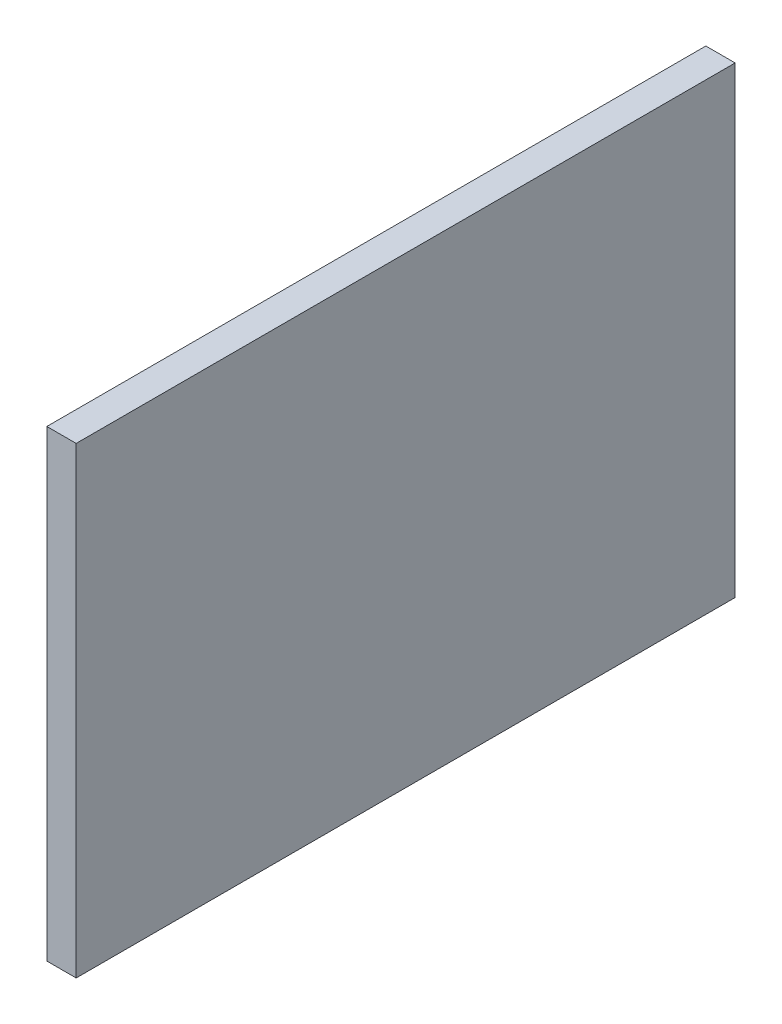
ISO-10303-21;
HEADER;
FILE_DESCRIPTION(('STEP AP214'),'2;1');
FILE_NAME('part.step','',(''),(''),'','','');
FILE_SCHEMA(('AUTOMOTIVE_DESIGN { 1 0 10303 214 1 1 1 1 }'));
ENDSEC;
DATA;
#1=APPLICATION_CONTEXT('core data for automotive mechanical design processes');
#2=APPLICATION_PROTOCOL_DEFINITION('international standard','automotive_design',2000,#1);
#3=PRODUCT_CONTEXT('',#1,'mechanical');
#4=PRODUCT('Part','Part','',(#3));
#5=PRODUCT_RELATED_PRODUCT_CATEGORY('part','',(#4));
#6=PRODUCT_DEFINITION_FORMATION('','',#4);
#7=PRODUCT_DEFINITION_CONTEXT('part definition',#1,'design');
#8=PRODUCT_DEFINITION('design','',#6,#7);
#9=PRODUCT_DEFINITION_SHAPE('','',#8);
#10=(LENGTH_UNIT() NAMED_UNIT(*) SI_UNIT(.MILLI.,.METRE.));
#11=(NAMED_UNIT(*) PLANE_ANGLE_UNIT() SI_UNIT($,.RADIAN.));
#12=(NAMED_UNIT(*) SI_UNIT($,.STERADIAN.) SOLID_ANGLE_UNIT());
#13=UNCERTAINTY_MEASURE_WITH_UNIT(LENGTH_MEASURE(1.E-05),#10,'distance_accuracy_value','');
#14=(GEOMETRIC_REPRESENTATION_CONTEXT(3) GLOBAL_UNCERTAINTY_ASSIGNED_CONTEXT((#13)) GLOBAL_UNIT_ASSIGNED_CONTEXT((#10,
#11,#12)) REPRESENTATION_CONTEXT('',''));
#15=CARTESIAN_POINT('',(0.,0.,0.));
#16=DIRECTION('',(0.,0.,1.));
#17=DIRECTION('',(1.,0.,0.));
#18=AXIS2_PLACEMENT_3D('',#15,#16,#17);
#19=CARTESIAN_POINT('',(19.,0.,0.));
#20=DIRECTION('',(0.,0.,-1.));
#21=DIRECTION('',(-1.,0.,0.));
#22=AXIS2_PLACEMENT_3D('',#19,#20,#21);
#23=PLANE('',#22);
#24=DIRECTION('',(0.,-1.,0.));
#25=VECTOR('',#24,1.);
#26=CARTESIAN_POINT('',(0.,0.,0.));
#27=LINE('',#26,#25);
#28=CARTESIAN_POINT('',(0.,300.,0.));
#29=VERTEX_POINT('',#28);
#30=CARTESIAN_POINT('',(0.,0.,0.));
#31=VERTEX_POINT('',#30);
#32=EDGE_CURVE('E96',#29,#31,#27,.T.);
#33=ORIENTED_EDGE('',*,*,#32,.T.);
#34=DIRECTION('',(-1.,0.,0.));
#35=VECTOR('',#34,1.);
#36=CARTESIAN_POINT('',(19.,0.,0.));
#37=LINE('',#36,#35);
#38=CARTESIAN_POINT('',(19.,0.,0.));
#39=VERTEX_POINT('',#38);
#40=EDGE_CURVE('E11',#39,#31,#37,.T.);
#41=ORIENTED_EDGE('',*,*,#40,.F.);
#42=DIRECTION('',(0.,-1.,0.));
#43=VECTOR('',#42,1.);
#44=CARTESIAN_POINT('',(19.,0.,0.));
#45=LINE('',#44,#43);
#46=CARTESIAN_POINT('',(19.,300.,0.));
#47=VERTEX_POINT('',#46);
#48=EDGE_CURVE('E84',#47,#39,#45,.T.);
#49=ORIENTED_EDGE('',*,*,#48,.F.);
#50=DIRECTION('',(-1.,0.,0.));
#51=VECTOR('',#50,1.);
#52=CARTESIAN_POINT('',(19.,300.,0.));
#53=LINE('',#52,#51);
#54=EDGE_CURVE('E92',#47,#29,#53,.T.);
#55=ORIENTED_EDGE('',*,*,#54,.T.);
#56=EDGE_LOOP('',(#33,#41,#49,#55));
#57=FACE_BOUND('',#56,.T.);
#58=ADVANCED_FACE('F33',(#57),#23,.F.);
#59=CARTESIAN_POINT('',(19.,0.,0.));
#60=DIRECTION('',(0.,1.,0.));
#61=DIRECTION('',(0.,0.,1.));
#62=AXIS2_PLACEMENT_3D('',#59,#60,#61);
#63=PLANE('',#62);
#64=DIRECTION('',(0.,0.,-1.));
#65=VECTOR('',#64,1.);
#66=CARTESIAN_POINT('',(0.,0.,0.));
#67=LINE('',#66,#65);
#68=CARTESIAN_POINT('',(0.,0.,-427.));
#69=VERTEX_POINT('',#68);
#70=EDGE_CURVE('E88',#31,#69,#67,.T.);
#71=ORIENTED_EDGE('',*,*,#70,.T.);
#72=DIRECTION('',(-1.,0.,0.));
#73=VECTOR('',#72,1.);
#74=CARTESIAN_POINT('',(19.,0.,-427.));
#75=LINE('',#74,#73);
#76=CARTESIAN_POINT('',(19.,0.,-427.));
#77=VERTEX_POINT('',#76);
#78=EDGE_CURVE('E41',#77,#69,#75,.T.);
#79=ORIENTED_EDGE('',*,*,#78,.F.);
#80=DIRECTION('',(0.,0.,-1.));
#81=VECTOR('',#80,1.);
#82=CARTESIAN_POINT('',(19.,0.,0.));
#83=LINE('',#82,#81);
#84=EDGE_CURVE('E79',#39,#77,#83,.T.);
#85=ORIENTED_EDGE('',*,*,#84,.F.);
#86=ORIENTED_EDGE('',*,*,#40,.T.);
#87=EDGE_LOOP('',(#71,#79,#85,#86));
#88=FACE_BOUND('',#87,.T.);
#89=ADVANCED_FACE('F87',(#88),#63,.F.);
#90=CARTESIAN_POINT('',(19.,0.,-427.));
#91=DIRECTION('',(0.,0.,1.));
#92=DIRECTION('',(1.,0.,0.));
#93=AXIS2_PLACEMENT_3D('',#90,#91,#92);
#94=PLANE('',#93);
#95=DIRECTION('',(0.,1.,0.));
#96=VECTOR('',#95,1.);
#97=CARTESIAN_POINT('',(0.,0.,-427.));
#98=LINE('',#97,#96);
#99=CARTESIAN_POINT('',(0.,300.,-427.));
#100=VERTEX_POINT('',#99);
#101=EDGE_CURVE('E66',#69,#100,#98,.T.);
#102=ORIENTED_EDGE('',*,*,#101,.T.);
#103=DIRECTION('',(-1.,0.,0.));
#104=VECTOR('',#103,1.);
#105=CARTESIAN_POINT('',(19.,300.,-427.));
#106=LINE('',#105,#104);
#107=CARTESIAN_POINT('',(19.,300.,-427.));
#108=VERTEX_POINT('',#107);
#109=EDGE_CURVE('E89',#108,#100,#106,.T.);
#110=ORIENTED_EDGE('',*,*,#109,.F.);
#111=DIRECTION('',(0.,1.,0.));
#112=VECTOR('',#111,1.);
#113=CARTESIAN_POINT('',(19.,0.,-427.));
#114=LINE('',#113,#112);
#115=EDGE_CURVE('E82',#77,#108,#114,.T.);
#116=ORIENTED_EDGE('',*,*,#115,.F.);
#117=ORIENTED_EDGE('',*,*,#78,.T.);
#118=EDGE_LOOP('',(#102,#110,#116,#117));
#119=FACE_BOUND('',#118,.T.);
#120=ADVANCED_FACE('F90',(#119),#94,.F.);
#121=CARTESIAN_POINT('',(19.,300.,0.));
#122=DIRECTION('',(0.,-1.,0.));
#123=DIRECTION('',(0.,0.,-1.));
#124=AXIS2_PLACEMENT_3D('',#121,#122,#123);
#125=PLANE('',#124);
#126=DIRECTION('',(0.,0.,1.));
#127=VECTOR('',#126,1.);
#128=CARTESIAN_POINT('',(0.,300.,0.));
#129=LINE('',#128,#127);
#130=EDGE_CURVE('E72',#100,#29,#129,.T.);
#131=ORIENTED_EDGE('',*,*,#130,.T.);
#132=ORIENTED_EDGE('',*,*,#54,.F.);
#133=DIRECTION('',(0.,0.,1.));
#134=VECTOR('',#133,1.);
#135=CARTESIAN_POINT('',(19.,300.,0.));
#136=LINE('',#135,#134);
#137=EDGE_CURVE('E49',#108,#47,#136,.T.);
#138=ORIENTED_EDGE('',*,*,#137,.F.);
#139=ORIENTED_EDGE('',*,*,#109,.T.);
#140=EDGE_LOOP('',(#131,#132,#138,#139));
#141=FACE_BOUND('',#140,.T.);
#142=ADVANCED_FACE('F103',(#141),#125,.F.);
#143=CARTESIAN_POINT('',(19.,0.,0.));
#144=DIRECTION('',(-1.,0.,0.));
#145=DIRECTION('',(0.,0.,1.));
#146=AXIS2_PLACEMENT_3D('',#143,#144,#145);
#147=PLANE('',#146);
#148=ORIENTED_EDGE('',*,*,#48,.T.);
#149=ORIENTED_EDGE('',*,*,#84,.T.);
#150=ORIENTED_EDGE('',*,*,#115,.T.);
#151=ORIENTED_EDGE('',*,*,#137,.T.);
#152=EDGE_LOOP('',(#148,#149,#150,#151));
#153=FACE_BOUND('',#152,.T.);
#154=ADVANCED_FACE('F80',(#153),#147,.F.);
#155=CARTESIAN_POINT('',(0.,0.,0.));
#156=DIRECTION('',(-1.,0.,0.));
#157=DIRECTION('',(0.,0.,1.));
#158=AXIS2_PLACEMENT_3D('',#155,#156,#157);
#159=PLANE('',#158);
#160=ORIENTED_EDGE('',*,*,#32,.F.);
#161=ORIENTED_EDGE('',*,*,#130,.F.);
#162=ORIENTED_EDGE('',*,*,#101,.F.);
#163=ORIENTED_EDGE('',*,*,#70,.F.);
#164=EDGE_LOOP('',(#160,#161,#162,#163));
#165=FACE_BOUND('',#164,.T.);
#166=ADVANCED_FACE('F106',(#165),#159,.T.);
#167=CLOSED_SHELL('',(#58,#89,#120,#142,#154,#166));
#168=MANIFOLD_SOLID_BREP('B2',#167);
#169=ADVANCED_BREP_SHAPE_REPRESENTATION('',(#18,#168),#14);
#170=SHAPE_DEFINITION_REPRESENTATION(#9,#169);
ENDSEC;
END-ISO-10303-21;
